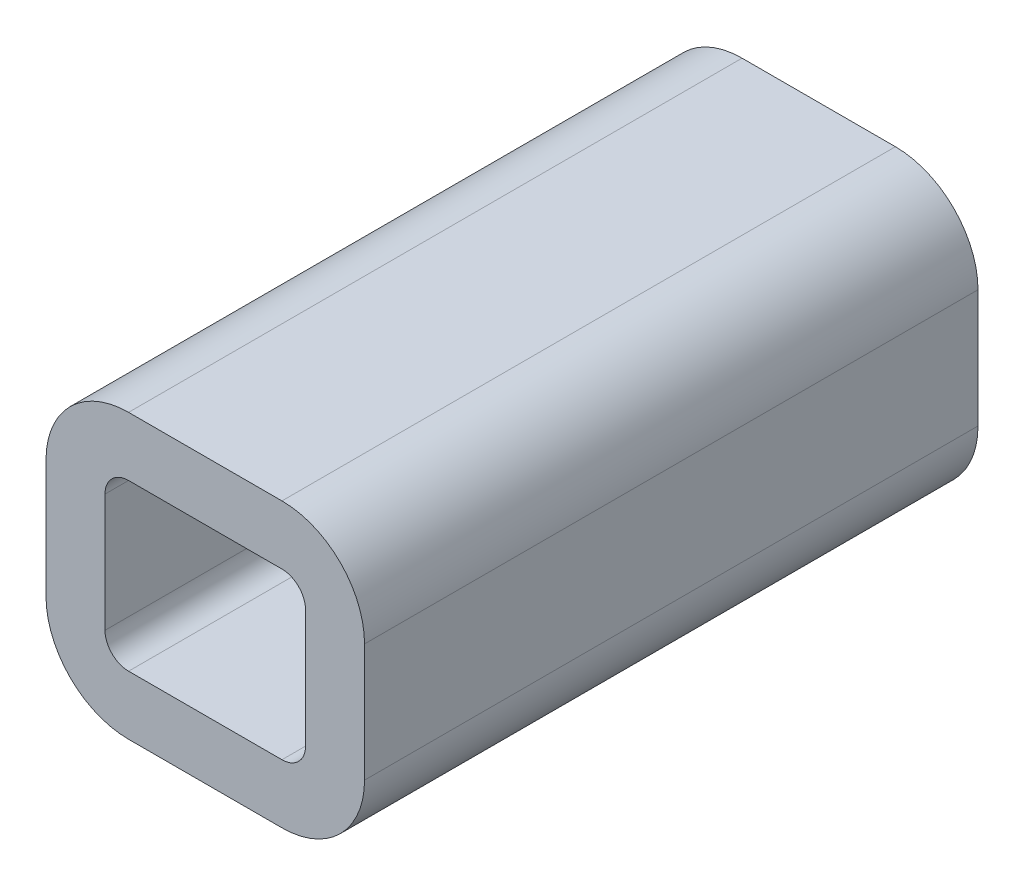
ISO-10303-21;
HEADER;
FILE_DESCRIPTION(('STEP AP214'),'2;1');
FILE_NAME('part.step','',(''),(''),'','','');
FILE_SCHEMA(('AUTOMOTIVE_DESIGN { 1 0 10303 214 1 1 1 1 }'));
ENDSEC;
DATA;
#1=APPLICATION_CONTEXT('core data for automotive mechanical design processes');
#2=APPLICATION_PROTOCOL_DEFINITION('international standard','automotive_design',2000,#1);
#3=PRODUCT_CONTEXT('',#1,'mechanical');
#4=PRODUCT('Part','Part','',(#3));
#5=PRODUCT_RELATED_PRODUCT_CATEGORY('part','',(#4));
#6=PRODUCT_DEFINITION_FORMATION('','',#4);
#7=PRODUCT_DEFINITION_CONTEXT('part definition',#1,'design');
#8=PRODUCT_DEFINITION('design','',#6,#7);
#9=PRODUCT_DEFINITION_SHAPE('','',#8);
#10=(LENGTH_UNIT() NAMED_UNIT(*) SI_UNIT(.MILLI.,.METRE.));
#11=(NAMED_UNIT(*) PLANE_ANGLE_UNIT() SI_UNIT($,.RADIAN.));
#12=(NAMED_UNIT(*) SI_UNIT($,.STERADIAN.) SOLID_ANGLE_UNIT());
#13=UNCERTAINTY_MEASURE_WITH_UNIT(LENGTH_MEASURE(1.E-05),#10,'distance_accuracy_value','');
#14=(GEOMETRIC_REPRESENTATION_CONTEXT(3) GLOBAL_UNCERTAINTY_ASSIGNED_CONTEXT((#13)) GLOBAL_UNIT_ASSIGNED_CONTEXT((#10,
#11,#12)) REPRESENTATION_CONTEXT('',''));
#15=CARTESIAN_POINT('',(0.,0.,0.));
#16=DIRECTION('',(0.,0.,1.));
#17=DIRECTION('',(1.,0.,0.));
#18=AXIS2_PLACEMENT_3D('',#15,#16,#17);
#19=CARTESIAN_POINT('',(0.325,0.25,2.6));
#20=DIRECTION('',(0.,0.,-1.));
#21=DIRECTION('',(-1.,0.,0.));
#22=AXIS2_PLACEMENT_3D('',#19,#20,#21);
#23=CYLINDRICAL_SURFACE('',#22,0.1);
#24=CARTESIAN_POINT('',(0.325,0.25,0.));
#25=DIRECTION('',(0.,0.,-1.));
#26=DIRECTION('',(-1.,0.,0.));
#27=AXIS2_PLACEMENT_3D('',#24,#25,#26);
#28=CIRCLE('',#27,0.1);
#29=CARTESIAN_POINT('',(0.425,0.25,0.));
#30=VERTEX_POINT('',#29);
#31=CARTESIAN_POINT('',(0.325,0.35,0.));
#32=VERTEX_POINT('',#31);
#33=EDGE_CURVE('E134',#30,#32,#28,.F.);
#34=ORIENTED_EDGE('',*,*,#33,.F.);
#35=DIRECTION('',(0.,0.,1.));
#36=VECTOR('',#35,1.);
#37=CARTESIAN_POINT('',(0.425,0.25,2.6));
#38=LINE('',#37,#36);
#39=CARTESIAN_POINT('',(0.425,0.25,2.6));
#40=VERTEX_POINT('',#39);
#41=EDGE_CURVE('E130',#40,#30,#38,.F.);
#42=ORIENTED_EDGE('',*,*,#41,.F.);
#43=CARTESIAN_POINT('',(0.325,0.25,2.6));
#44=DIRECTION('',(0.,0.,-1.));
#45=DIRECTION('',(-1.,0.,0.));
#46=AXIS2_PLACEMENT_3D('',#43,#44,#45);
#47=CIRCLE('',#46,0.1);
#48=CARTESIAN_POINT('',(0.325,0.35,2.6));
#49=VERTEX_POINT('',#48);
#50=EDGE_CURVE('E20',#49,#40,#47,.T.);
#51=ORIENTED_EDGE('',*,*,#50,.F.);
#52=DIRECTION('',(0.,0.,1.));
#53=VECTOR('',#52,1.);
#54=CARTESIAN_POINT('',(0.325,0.35,2.6));
#55=LINE('',#54,#53);
#56=EDGE_CURVE('E128',#32,#49,#55,.T.);
#57=ORIENTED_EDGE('',*,*,#56,.F.);
#58=EDGE_LOOP('',(#34,#42,#51,#57));
#59=FACE_BOUND('',#58,.T.);
#60=ADVANCED_FACE('F17',(#59),#23,.F.);
#61=CARTESIAN_POINT('',(0.425,-0.249999999999999,2.6));
#62=DIRECTION('',(-1.,0.,0.));
#63=DIRECTION('',(0.,0.,1.));
#64=AXIS2_PLACEMENT_3D('',#61,#62,#63);
#65=PLANE('',#64);
#66=DIRECTION('',(0.,1.,0.));
#67=VECTOR('',#66,1.);
#68=CARTESIAN_POINT('',(0.425,-0.249999999999999,0.));
#69=LINE('',#68,#67);
#70=CARTESIAN_POINT('',(0.425,-0.25,0.));
#71=VERTEX_POINT('',#70);
#72=EDGE_CURVE('E165',#30,#71,#69,.F.);
#73=ORIENTED_EDGE('',*,*,#72,.T.);
#74=DIRECTION('',(0.,0.,-1.));
#75=VECTOR('',#74,1.);
#76=CARTESIAN_POINT('',(0.425,-0.25,2.6));
#77=LINE('',#76,#75);
#78=CARTESIAN_POINT('',(0.425,-0.25,2.6));
#79=VERTEX_POINT('',#78);
#80=EDGE_CURVE('E171',#71,#79,#77,.F.);
#81=ORIENTED_EDGE('',*,*,#80,.T.);
#82=DIRECTION('',(0.,1.,0.));
#83=VECTOR('',#82,1.);
#84=CARTESIAN_POINT('',(0.425,-0.249999999999999,2.6));
#85=LINE('',#84,#83);
#86=EDGE_CURVE('E176',#79,#40,#85,.T.);
#87=ORIENTED_EDGE('',*,*,#86,.T.);
#88=ORIENTED_EDGE('',*,*,#41,.T.);
#89=EDGE_LOOP('',(#73,#81,#87,#88));
#90=FACE_BOUND('',#89,.T.);
#91=ADVANCED_FACE('F222',(#90),#65,.T.);
#92=CARTESIAN_POINT('',(0.324999999999999,-0.6,2.6));
#93=DIRECTION('',(0.,1.,0.));
#94=DIRECTION('',(-1.,0.,0.));
#95=AXIS2_PLACEMENT_3D('',#92,#93,#94);
#96=PLANE('',#95);
#97=DIRECTION('',(-1.,0.,0.));
#98=VECTOR('',#97,1.);
#99=CARTESIAN_POINT('',(0.324999999999999,-0.6,0.));
#100=LINE('',#99,#98);
#101=CARTESIAN_POINT('',(0.325,-0.6,0.));
#102=VERTEX_POINT('',#101);
#103=CARTESIAN_POINT('',(-0.325,-0.6,0.));
#104=VERTEX_POINT('',#103);
#105=EDGE_CURVE('E148',#102,#104,#100,.T.);
#106=ORIENTED_EDGE('',*,*,#105,.F.);
#107=DIRECTION('',(0.,0.,-1.));
#108=VECTOR('',#107,1.);
#109=CARTESIAN_POINT('',(0.325,-0.6,2.6));
#110=LINE('',#109,#108);
#111=CARTESIAN_POINT('',(0.325,-0.6,2.6));
#112=VERTEX_POINT('',#111);
#113=EDGE_CURVE('E158',#112,#102,#110,.T.);
#114=ORIENTED_EDGE('',*,*,#113,.F.);
#115=DIRECTION('',(-1.,0.,0.));
#116=VECTOR('',#115,1.);
#117=CARTESIAN_POINT('',(0.324999999999999,-0.6,2.6));
#118=LINE('',#117,#116);
#119=CARTESIAN_POINT('',(-0.325,-0.6,2.6));
#120=VERTEX_POINT('',#119);
#121=EDGE_CURVE('E152',#120,#112,#118,.F.);
#122=ORIENTED_EDGE('',*,*,#121,.F.);
#123=DIRECTION('',(0.,0.,-1.));
#124=VECTOR('',#123,1.);
#125=CARTESIAN_POINT('',(-0.325,-0.6,2.6));
#126=LINE('',#125,#124);
#127=EDGE_CURVE('E179',#104,#120,#126,.F.);
#128=ORIENTED_EDGE('',*,*,#127,.F.);
#129=EDGE_LOOP('',(#106,#114,#122,#128));
#130=FACE_BOUND('',#129,.T.);
#131=ADVANCED_FACE('F404',(#130),#96,.F.);
#132=CARTESIAN_POINT('',(0.324999999999999,0.35,2.6));
#133=DIRECTION('',(0.,-1.,0.));
#134=DIRECTION('',(1.,0.,0.));
#135=AXIS2_PLACEMENT_3D('',#132,#133,#134);
#136=PLANE('',#135);
#137=DIRECTION('',(1.,0.,0.));
#138=VECTOR('',#137,1.);
#139=CARTESIAN_POINT('',(0.324999999999999,0.35,0.));
#140=LINE('',#139,#138);
#141=CARTESIAN_POINT('',(-0.325,0.35,0.));
#142=VERTEX_POINT('',#141);
#143=EDGE_CURVE('E140',#142,#32,#140,.T.);
#144=ORIENTED_EDGE('',*,*,#143,.T.);
#145=ORIENTED_EDGE('',*,*,#56,.T.);
#146=DIRECTION('',(1.,0.,0.));
#147=VECTOR('',#146,1.);
#148=CARTESIAN_POINT('',(0.324999999999999,0.35,2.6));
#149=LINE('',#148,#147);
#150=CARTESIAN_POINT('',(-0.325,0.35,2.6));
#151=VERTEX_POINT('',#150);
#152=EDGE_CURVE('E138',#49,#151,#149,.F.);
#153=ORIENTED_EDGE('',*,*,#152,.T.);
#154=DIRECTION('',(0.,0.,-1.));
#155=VECTOR('',#154,1.);
#156=CARTESIAN_POINT('',(-0.325,0.35,2.6));
#157=LINE('',#156,#155);
#158=EDGE_CURVE('E206',#151,#142,#157,.T.);
#159=ORIENTED_EDGE('',*,*,#158,.T.);
#160=EDGE_LOOP('',(#144,#145,#153,#159));
#161=FACE_BOUND('',#160,.T.);
#162=ADVANCED_FACE('F136',(#161),#136,.T.);
#163=CARTESIAN_POINT('',(-0.425,-0.249999999999999,2.6));
#164=DIRECTION('',(1.,0.,0.));
#165=DIRECTION('',(0.,0.,-1.));
#166=AXIS2_PLACEMENT_3D('',#163,#164,#165);
#167=PLANE('',#166);
#168=DIRECTION('',(0.,1.,0.));
#169=VECTOR('',#168,1.);
#170=CARTESIAN_POINT('',(-0.425,-0.249999999999999,0.));
#171=LINE('',#170,#169);
#172=CARTESIAN_POINT('',(-0.425,-0.25,0.));
#173=VERTEX_POINT('',#172);
#174=CARTESIAN_POINT('',(-0.425,0.25,0.));
#175=VERTEX_POINT('',#174);
#176=EDGE_CURVE('E155',#173,#175,#171,.T.);
#177=ORIENTED_EDGE('',*,*,#176,.T.);
#178=DIRECTION('',(0.,0.,-1.));
#179=VECTOR('',#178,1.);
#180=CARTESIAN_POINT('',(-0.425,0.25,2.6));
#181=LINE('',#180,#179);
#182=CARTESIAN_POINT('',(-0.425,0.25,2.6));
#183=VERTEX_POINT('',#182);
#184=EDGE_CURVE('E205',#175,#183,#181,.F.);
#185=ORIENTED_EDGE('',*,*,#184,.T.);
#186=DIRECTION('',(0.,1.,0.));
#187=VECTOR('',#186,1.);
#188=CARTESIAN_POINT('',(-0.425,-0.249999999999999,2.6));
#189=LINE('',#188,#187);
#190=CARTESIAN_POINT('',(-0.425,-0.25,2.6));
#191=VERTEX_POINT('',#190);
#192=EDGE_CURVE('E142',#183,#191,#189,.F.);
#193=ORIENTED_EDGE('',*,*,#192,.T.);
#194=DIRECTION('',(0.,0.,-1.));
#195=VECTOR('',#194,1.);
#196=CARTESIAN_POINT('',(-0.425,-0.25,2.6));
#197=LINE('',#196,#195);
#198=EDGE_CURVE('E166',#191,#173,#197,.T.);
#199=ORIENTED_EDGE('',*,*,#198,.T.);
#200=EDGE_LOOP('',(#177,#185,#193,#199));
#201=FACE_BOUND('',#200,.T.);
#202=ADVANCED_FACE('F261',(#201),#167,.T.);
#203=CARTESIAN_POINT('',(-0.325,-0.25,2.6));
#204=DIRECTION('',(0.,0.,-1.));
#205=DIRECTION('',(-1.,0.,0.));
#206=AXIS2_PLACEMENT_3D('',#203,#204,#205);
#207=CYLINDRICAL_SURFACE('',#206,0.35);
#208=CARTESIAN_POINT('',(-0.325,-0.25,0.));
#209=DIRECTION('',(0.,0.,-1.));
#210=DIRECTION('',(-1.,0.,0.));
#211=AXIS2_PLACEMENT_3D('',#208,#209,#210);
#212=CIRCLE('',#211,0.35);
#213=CARTESIAN_POINT('',(-0.675,-0.25,0.));
#214=VERTEX_POINT('',#213);
#215=EDGE_CURVE('E182',#214,#104,#212,.F.);
#216=ORIENTED_EDGE('',*,*,#215,.T.);
#217=ORIENTED_EDGE('',*,*,#127,.T.);
#218=CARTESIAN_POINT('',(-0.325,-0.25,2.6));
#219=DIRECTION('',(0.,0.,-1.));
#220=DIRECTION('',(-1.,0.,0.));
#221=AXIS2_PLACEMENT_3D('',#218,#219,#220);
#222=CIRCLE('',#221,0.35);
#223=CARTESIAN_POINT('',(-0.675,-0.25,2.6));
#224=VERTEX_POINT('',#223);
#225=EDGE_CURVE('E216',#120,#224,#222,.T.);
#226=ORIENTED_EDGE('',*,*,#225,.T.);
#227=DIRECTION('',(0.,0.,-1.));
#228=VECTOR('',#227,1.);
#229=CARTESIAN_POINT('',(-0.675,-0.25,2.6));
#230=LINE('',#229,#228);
#231=EDGE_CURVE('E253',#224,#214,#230,.T.);
#232=ORIENTED_EDGE('',*,*,#231,.T.);
#233=EDGE_LOOP('',(#216,#217,#226,#232));
#234=FACE_BOUND('',#233,.T.);
#235=ADVANCED_FACE('F381',(#234),#207,.T.);
#236=CARTESIAN_POINT('',(0.325,-0.25,2.6));
#237=DIRECTION('',(0.,0.,-1.));
#238=DIRECTION('',(-1.,0.,0.));
#239=AXIS2_PLACEMENT_3D('',#236,#237,#238);
#240=CYLINDRICAL_SURFACE('',#239,0.1);
#241=CARTESIAN_POINT('',(0.325,-0.25,0.));
#242=DIRECTION('',(0.,0.,-1.));
#243=DIRECTION('',(-1.,0.,0.));
#244=AXIS2_PLACEMENT_3D('',#241,#242,#243);
#245=CIRCLE('',#244,0.1);
#246=CARTESIAN_POINT('',(0.325,-0.35,0.));
#247=VERTEX_POINT('',#246);
#248=EDGE_CURVE('E174',#247,#71,#245,.F.);
#249=ORIENTED_EDGE('',*,*,#248,.F.);
#250=DIRECTION('',(0.,0.,1.));
#251=VECTOR('',#250,1.);
#252=CARTESIAN_POINT('',(0.325,-0.35,2.6));
#253=LINE('',#252,#251);
#254=CARTESIAN_POINT('',(0.325,-0.35,2.6));
#255=VERTEX_POINT('',#254);
#256=EDGE_CURVE('E229',#255,#247,#253,.F.);
#257=ORIENTED_EDGE('',*,*,#256,.F.);
#258=CARTESIAN_POINT('',(0.325,-0.25,2.6));
#259=DIRECTION('',(0.,0.,-1.));
#260=DIRECTION('',(-1.,0.,0.));
#261=AXIS2_PLACEMENT_3D('',#258,#259,#260);
#262=CIRCLE('',#261,0.1);
#263=EDGE_CURVE('E181',#79,#255,#262,.T.);
#264=ORIENTED_EDGE('',*,*,#263,.F.);
#265=ORIENTED_EDGE('',*,*,#80,.F.);
#266=EDGE_LOOP('',(#249,#257,#264,#265));
#267=FACE_BOUND('',#266,.T.);
#268=ADVANCED_FACE('F230',(#267),#240,.F.);
#269=CARTESIAN_POINT('',(-0.325,-0.25,2.6));
#270=DIRECTION('',(0.,0.,-1.));
#271=DIRECTION('',(-1.,0.,0.));
#272=AXIS2_PLACEMENT_3D('',#269,#270,#271);
#273=CYLINDRICAL_SURFACE('',#272,0.1);
#274=CARTESIAN_POINT('',(-0.325,-0.25,0.));
#275=DIRECTION('',(0.,0.,-1.));
#276=DIRECTION('',(-1.,0.,0.));
#277=AXIS2_PLACEMENT_3D('',#274,#275,#276);
#278=CIRCLE('',#277,0.1);
#279=CARTESIAN_POINT('',(-0.325,-0.35,0.));
#280=VERTEX_POINT('',#279);
#281=EDGE_CURVE('E169',#173,#280,#278,.F.);
#282=ORIENTED_EDGE('',*,*,#281,.F.);
#283=ORIENTED_EDGE('',*,*,#198,.F.);
#284=CARTESIAN_POINT('',(-0.325,-0.25,2.6));
#285=DIRECTION('',(0.,0.,-1.));
#286=DIRECTION('',(-1.,0.,0.));
#287=AXIS2_PLACEMENT_3D('',#284,#285,#286);
#288=CIRCLE('',#287,0.1);
#289=CARTESIAN_POINT('',(-0.325,-0.35,2.6));
#290=VERTEX_POINT('',#289);
#291=EDGE_CURVE('E170',#290,#191,#288,.T.);
#292=ORIENTED_EDGE('',*,*,#291,.F.);
#293=DIRECTION('',(0.,0.,1.));
#294=VECTOR('',#293,1.);
#295=CARTESIAN_POINT('',(-0.325,-0.35,2.6));
#296=LINE('',#295,#294);
#297=EDGE_CURVE('E234',#280,#290,#296,.T.);
#298=ORIENTED_EDGE('',*,*,#297,.F.);
#299=EDGE_LOOP('',(#282,#283,#292,#298));
#300=FACE_BOUND('',#299,.T.);
#301=ADVANCED_FACE('F276',(#300),#273,.F.);
#302=CARTESIAN_POINT('',(0.325,-0.25,2.6));
#303=DIRECTION('',(0.,0.,-1.));
#304=DIRECTION('',(-1.,0.,0.));
#305=AXIS2_PLACEMENT_3D('',#302,#303,#304);
#306=CYLINDRICAL_SURFACE('',#305,0.35);
#307=CARTESIAN_POINT('',(0.325,-0.25,0.));
#308=DIRECTION('',(0.,0.,-1.));
#309=DIRECTION('',(-1.,0.,0.));
#310=AXIS2_PLACEMENT_3D('',#307,#308,#309);
#311=CIRCLE('',#310,0.35);
#312=CARTESIAN_POINT('',(0.675,-0.25,0.));
#313=VERTEX_POINT('',#312);
#314=EDGE_CURVE('E160',#102,#313,#311,.F.);
#315=ORIENTED_EDGE('',*,*,#314,.T.);
#316=DIRECTION('',(0.,0.,1.));
#317=VECTOR('',#316,1.);
#318=CARTESIAN_POINT('',(0.675,-0.25,2.6));
#319=LINE('',#318,#317);
#320=CARTESIAN_POINT('',(0.675,-0.25,2.6));
#321=VERTEX_POINT('',#320);
#322=EDGE_CURVE('E240',#313,#321,#319,.T.);
#323=ORIENTED_EDGE('',*,*,#322,.T.);
#324=CARTESIAN_POINT('',(0.325,-0.25,2.6));
#325=DIRECTION('',(0.,0.,-1.));
#326=DIRECTION('',(-1.,0.,0.));
#327=AXIS2_PLACEMENT_3D('',#324,#325,#326);
#328=CIRCLE('',#327,0.35);
#329=EDGE_CURVE('E161',#321,#112,#328,.T.);
#330=ORIENTED_EDGE('',*,*,#329,.T.);
#331=ORIENTED_EDGE('',*,*,#113,.T.);
#332=EDGE_LOOP('',(#315,#323,#330,#331));
#333=FACE_BOUND('',#332,.T.);
#334=ADVANCED_FACE('F267',(#333),#306,.T.);
#335=CARTESIAN_POINT('',(-0.325,0.25,2.6));
#336=DIRECTION('',(0.,0.,-1.));
#337=DIRECTION('',(-1.,0.,0.));
#338=AXIS2_PLACEMENT_3D('',#335,#336,#337);
#339=CYLINDRICAL_SURFACE('',#338,0.1);
#340=CARTESIAN_POINT('',(-0.325,0.25,0.));
#341=DIRECTION('',(0.,0.,-1.));
#342=DIRECTION('',(-1.,0.,0.));
#343=AXIS2_PLACEMENT_3D('',#340,#341,#342);
#344=CIRCLE('',#343,0.1);
#345=EDGE_CURVE('E202',#142,#175,#344,.F.);
#346=ORIENTED_EDGE('',*,*,#345,.F.);
#347=ORIENTED_EDGE('',*,*,#158,.F.);
#348=CARTESIAN_POINT('',(-0.325,0.25,2.6));
#349=DIRECTION('',(0.,0.,-1.));
#350=DIRECTION('',(-1.,0.,0.));
#351=AXIS2_PLACEMENT_3D('',#348,#349,#350);
#352=CIRCLE('',#351,0.1);
#353=EDGE_CURVE('E147',#183,#151,#352,.T.);
#354=ORIENTED_EDGE('',*,*,#353,.F.);
#355=ORIENTED_EDGE('',*,*,#184,.F.);
#356=EDGE_LOOP('',(#346,#347,#354,#355));
#357=FACE_BOUND('',#356,.T.);
#358=ADVANCED_FACE('F264',(#357),#339,.F.);
#359=CARTESIAN_POINT('',(-0.675,-0.249999999999999,2.6));
#360=DIRECTION('',(1.,0.,0.));
#361=DIRECTION('',(0.,0.,-1.));
#362=AXIS2_PLACEMENT_3D('',#359,#360,#361);
#363=PLANE('',#362);
#364=DIRECTION('',(0.,1.,0.));
#365=VECTOR('',#364,1.);
#366=CARTESIAN_POINT('',(-0.675,-0.249999999999999,0.));
#367=LINE('',#366,#365);
#368=CARTESIAN_POINT('',(-0.675,0.25,0.));
#369=VERTEX_POINT('',#368);
#370=EDGE_CURVE('E235',#214,#369,#367,.T.);
#371=ORIENTED_EDGE('',*,*,#370,.F.);
#372=ORIENTED_EDGE('',*,*,#231,.F.);
#373=DIRECTION('',(0.,1.,0.));
#374=VECTOR('',#373,1.);
#375=CARTESIAN_POINT('',(-0.675,0.25,2.6));
#376=LINE('',#375,#374);
#377=CARTESIAN_POINT('',(-0.675,0.25,2.6));
#378=VERTEX_POINT('',#377);
#379=EDGE_CURVE('E200',#378,#224,#376,.F.);
#380=ORIENTED_EDGE('',*,*,#379,.F.);
#381=DIRECTION('',(0.,0.,-1.));
#382=VECTOR('',#381,1.);
#383=CARTESIAN_POINT('',(-0.675,0.25,2.6));
#384=LINE('',#383,#382);
#385=EDGE_CURVE('E197',#369,#378,#384,.F.);
#386=ORIENTED_EDGE('',*,*,#385,.F.);
#387=EDGE_LOOP('',(#371,#372,#380,#386));
#388=FACE_BOUND('',#387,.T.);
#389=ADVANCED_FACE('F266',(#388),#363,.F.);
#390=CARTESIAN_POINT('',(0.324999999999999,-0.35,2.6));
#391=DIRECTION('',(0.,1.,0.));
#392=DIRECTION('',(-1.,0.,0.));
#393=AXIS2_PLACEMENT_3D('',#390,#391,#392);
#394=PLANE('',#393);
#395=DIRECTION('',(1.,0.,0.));
#396=VECTOR('',#395,1.);
#397=CARTESIAN_POINT('',(0.325,-0.35,0.));
#398=LINE('',#397,#396);
#399=EDGE_CURVE('E249',#247,#280,#398,.F.);
#400=ORIENTED_EDGE('',*,*,#399,.T.);
#401=ORIENTED_EDGE('',*,*,#297,.T.);
#402=DIRECTION('',(1.,0.,0.));
#403=VECTOR('',#402,1.);
#404=CARTESIAN_POINT('',(0.325,-0.35,2.6));
#405=LINE('',#404,#403);
#406=EDGE_CURVE('E201',#255,#290,#405,.F.);
#407=ORIENTED_EDGE('',*,*,#406,.F.);
#408=ORIENTED_EDGE('',*,*,#256,.T.);
#409=EDGE_LOOP('',(#400,#401,#407,#408));
#410=FACE_BOUND('',#409,.T.);
#411=ADVANCED_FACE('F238',(#410),#394,.T.);
#412=CARTESIAN_POINT('',(0.675,-0.249999999999998,2.6));
#413=DIRECTION('',(-1.,0.,0.));
#414=DIRECTION('',(0.,0.,1.));
#415=AXIS2_PLACEMENT_3D('',#412,#413,#414);
#416=PLANE('',#415);
#417=DIRECTION('',(0.,1.,0.));
#418=VECTOR('',#417,1.);
#419=CARTESIAN_POINT('',(0.675,0.25,0.));
#420=LINE('',#419,#418);
#421=CARTESIAN_POINT('',(0.675,0.25,0.));
#422=VERTEX_POINT('',#421);
#423=EDGE_CURVE('E194',#313,#422,#420,.T.);
#424=ORIENTED_EDGE('',*,*,#423,.T.);
#425=DIRECTION('',(0.,0.,-1.));
#426=VECTOR('',#425,1.);
#427=CARTESIAN_POINT('',(0.675,0.25,2.6));
#428=LINE('',#427,#426);
#429=CARTESIAN_POINT('',(0.675,0.25,2.6));
#430=VERTEX_POINT('',#429);
#431=EDGE_CURVE('E187',#430,#422,#428,.T.);
#432=ORIENTED_EDGE('',*,*,#431,.F.);
#433=DIRECTION('',(0.,1.,0.));
#434=VECTOR('',#433,1.);
#435=CARTESIAN_POINT('',(0.675,0.25,2.6));
#436=LINE('',#435,#434);
#437=EDGE_CURVE('E198',#321,#430,#436,.T.);
#438=ORIENTED_EDGE('',*,*,#437,.F.);
#439=ORIENTED_EDGE('',*,*,#322,.F.);
#440=EDGE_LOOP('',(#424,#432,#438,#439));
#441=FACE_BOUND('',#440,.T.);
#442=ADVANCED_FACE('F299',(#441),#416,.F.);
#443=CARTESIAN_POINT('',(0.325,0.25,2.6));
#444=DIRECTION('',(0.,0.,1.));
#445=DIRECTION('',(1.,0.,0.));
#446=AXIS2_PLACEMENT_3D('',#443,#444,#445);
#447=PLANE('',#446);
#448=CARTESIAN_POINT('',(0.325,0.25,2.6));
#449=DIRECTION('',(0.,0.,-1.));
#450=DIRECTION('',(-1.,0.,0.));
#451=AXIS2_PLACEMENT_3D('',#448,#449,#450);
#452=CIRCLE('',#451,0.35);
#453=CARTESIAN_POINT('',(0.325,0.6,2.6));
#454=VERTEX_POINT('',#453);
#455=EDGE_CURVE('E188',#454,#430,#452,.T.);
#456=ORIENTED_EDGE('',*,*,#455,.F.);
#457=DIRECTION('',(1.,0.,0.));
#458=VECTOR('',#457,1.);
#459=CARTESIAN_POINT('',(0.324999999999999,0.6,2.6));
#460=LINE('',#459,#458);
#461=CARTESIAN_POINT('',(-0.325,0.6,2.6));
#462=VERTEX_POINT('',#461);
#463=EDGE_CURVE('E186',#454,#462,#460,.F.);
#464=ORIENTED_EDGE('',*,*,#463,.T.);
#465=CARTESIAN_POINT('',(-0.325,0.25,2.6));
#466=DIRECTION('',(0.,0.,-1.));
#467=DIRECTION('',(-1.,0.,0.));
#468=AXIS2_PLACEMENT_3D('',#465,#466,#467);
#469=CIRCLE('',#468,0.35);
#470=EDGE_CURVE('E195',#378,#462,#469,.T.);
#471=ORIENTED_EDGE('',*,*,#470,.F.);
#472=ORIENTED_EDGE('',*,*,#379,.T.);
#473=ORIENTED_EDGE('',*,*,#225,.F.);
#474=ORIENTED_EDGE('',*,*,#121,.T.);
#475=ORIENTED_EDGE('',*,*,#329,.F.);
#476=ORIENTED_EDGE('',*,*,#437,.T.);
#477=EDGE_LOOP('',(#456,#464,#471,#472,#473,#474,#475,#476));
#478=FACE_BOUND('',#477,.T.);
#479=ORIENTED_EDGE('',*,*,#192,.F.);
#480=ORIENTED_EDGE('',*,*,#353,.T.);
#481=ORIENTED_EDGE('',*,*,#152,.F.);
#482=ORIENTED_EDGE('',*,*,#50,.T.);
#483=ORIENTED_EDGE('',*,*,#86,.F.);
#484=ORIENTED_EDGE('',*,*,#263,.T.);
#485=ORIENTED_EDGE('',*,*,#406,.T.);
#486=ORIENTED_EDGE('',*,*,#291,.T.);
#487=EDGE_LOOP('',(#479,#480,#481,#482,#483,#484,#485,#486));
#488=FACE_BOUND('',#487,.T.);
#489=ADVANCED_FACE('F145',(#478,#488),#447,.T.);
#490=CARTESIAN_POINT('',(-0.325,0.25,2.6));
#491=DIRECTION('',(0.,0.,-1.));
#492=DIRECTION('',(-1.,0.,0.));
#493=AXIS2_PLACEMENT_3D('',#490,#491,#492);
#494=CYLINDRICAL_SURFACE('',#493,0.35);
#495=CARTESIAN_POINT('',(-0.325,0.25,0.));
#496=DIRECTION('',(0.,0.,-1.));
#497=DIRECTION('',(-1.,0.,0.));
#498=AXIS2_PLACEMENT_3D('',#495,#496,#497);
#499=CIRCLE('',#498,0.35);
#500=CARTESIAN_POINT('',(-0.325,0.6,0.));
#501=VERTEX_POINT('',#500);
#502=EDGE_CURVE('E191',#501,#369,#499,.F.);
#503=ORIENTED_EDGE('',*,*,#502,.T.);
#504=ORIENTED_EDGE('',*,*,#385,.T.);
#505=ORIENTED_EDGE('',*,*,#470,.T.);
#506=DIRECTION('',(0.,0.,-1.));
#507=VECTOR('',#506,1.);
#508=CARTESIAN_POINT('',(-0.325,0.6,2.6));
#509=LINE('',#508,#507);
#510=EDGE_CURVE('E451',#462,#501,#509,.T.);
#511=ORIENTED_EDGE('',*,*,#510,.T.);
#512=EDGE_LOOP('',(#503,#504,#505,#511));
#513=FACE_BOUND('',#512,.T.);
#514=ADVANCED_FACE('F292',(#513),#494,.T.);
#515=CARTESIAN_POINT('',(0.325,0.25,0.));
#516=DIRECTION('',(0.,0.,1.));
#517=DIRECTION('',(1.,0.,0.));
#518=AXIS2_PLACEMENT_3D('',#515,#516,#517);
#519=PLANE('',#518);
#520=ORIENTED_EDGE('',*,*,#215,.F.);
#521=ORIENTED_EDGE('',*,*,#370,.T.);
#522=ORIENTED_EDGE('',*,*,#502,.F.);
#523=DIRECTION('',(1.,0.,0.));
#524=VECTOR('',#523,1.);
#525=CARTESIAN_POINT('',(0.324999999999999,0.6,0.));
#526=LINE('',#525,#524);
#527=CARTESIAN_POINT('',(0.325,0.6,0.));
#528=VERTEX_POINT('',#527);
#529=EDGE_CURVE('E26',#501,#528,#526,.T.);
#530=ORIENTED_EDGE('',*,*,#529,.T.);
#531=CARTESIAN_POINT('',(0.325,0.25,0.));
#532=DIRECTION('',(0.,0.,-1.));
#533=DIRECTION('',(-1.,0.,0.));
#534=AXIS2_PLACEMENT_3D('',#531,#532,#533);
#535=CIRCLE('',#534,0.35);
#536=EDGE_CURVE('E34',#422,#528,#535,.F.);
#537=ORIENTED_EDGE('',*,*,#536,.F.);
#538=ORIENTED_EDGE('',*,*,#423,.F.);
#539=ORIENTED_EDGE('',*,*,#314,.F.);
#540=ORIENTED_EDGE('',*,*,#105,.T.);
#541=EDGE_LOOP('',(#520,#521,#522,#530,#537,#538,#539,#540));
#542=FACE_BOUND('',#541,.T.);
#543=ORIENTED_EDGE('',*,*,#248,.T.);
#544=ORIENTED_EDGE('',*,*,#72,.F.);
#545=ORIENTED_EDGE('',*,*,#33,.T.);
#546=ORIENTED_EDGE('',*,*,#143,.F.);
#547=ORIENTED_EDGE('',*,*,#345,.T.);
#548=ORIENTED_EDGE('',*,*,#176,.F.);
#549=ORIENTED_EDGE('',*,*,#281,.T.);
#550=ORIENTED_EDGE('',*,*,#399,.F.);
#551=EDGE_LOOP('',(#543,#544,#545,#546,#547,#548,#549,#550));
#552=FACE_BOUND('',#551,.T.);
#553=ADVANCED_FACE('F219',(#542,#552),#519,.F.);
#554=CARTESIAN_POINT('',(0.325,0.25,2.6));
#555=DIRECTION('',(0.,0.,-1.));
#556=DIRECTION('',(-1.,0.,0.));
#557=AXIS2_PLACEMENT_3D('',#554,#555,#556);
#558=CYLINDRICAL_SURFACE('',#557,0.35);
#559=ORIENTED_EDGE('',*,*,#536,.T.);
#560=DIRECTION('',(0.,0.,-1.));
#561=VECTOR('',#560,1.);
#562=CARTESIAN_POINT('',(0.325,0.6,2.6));
#563=LINE('',#562,#561);
#564=EDGE_CURVE('E11',#528,#454,#563,.F.);
#565=ORIENTED_EDGE('',*,*,#564,.T.);
#566=ORIENTED_EDGE('',*,*,#455,.T.);
#567=ORIENTED_EDGE('',*,*,#431,.T.);
#568=EDGE_LOOP('',(#559,#565,#566,#567));
#569=FACE_BOUND('',#568,.T.);
#570=ADVANCED_FACE('F281',(#569),#558,.T.);
#571=CARTESIAN_POINT('',(0.324999999999999,0.6,2.6));
#572=DIRECTION('',(0.,-1.,0.));
#573=DIRECTION('',(0.,0.,-1.));
#574=AXIS2_PLACEMENT_3D('',#571,#572,#573);
#575=PLANE('',#574);
#576=ORIENTED_EDGE('',*,*,#529,.F.);
#577=ORIENTED_EDGE('',*,*,#510,.F.);
#578=ORIENTED_EDGE('',*,*,#463,.F.);
#579=ORIENTED_EDGE('',*,*,#564,.F.);
#580=EDGE_LOOP('',(#576,#577,#578,#579));
#581=FACE_BOUND('',#580,.T.);
#582=ADVANCED_FACE('F279',(#581),#575,.F.);
#583=CLOSED_SHELL('',(#60,#91,#131,#162,#202,#235,#268,#301,#334,#358,#389,#411,#442,#489,#514,
#553,#570,#582));
#584=MANIFOLD_SOLID_BREP('B1',#583);
#585=ADVANCED_BREP_SHAPE_REPRESENTATION('',(#18,#584),#14);
#586=SHAPE_DEFINITION_REPRESENTATION(#9,#585);
ENDSEC;
END-ISO-10303-21;
